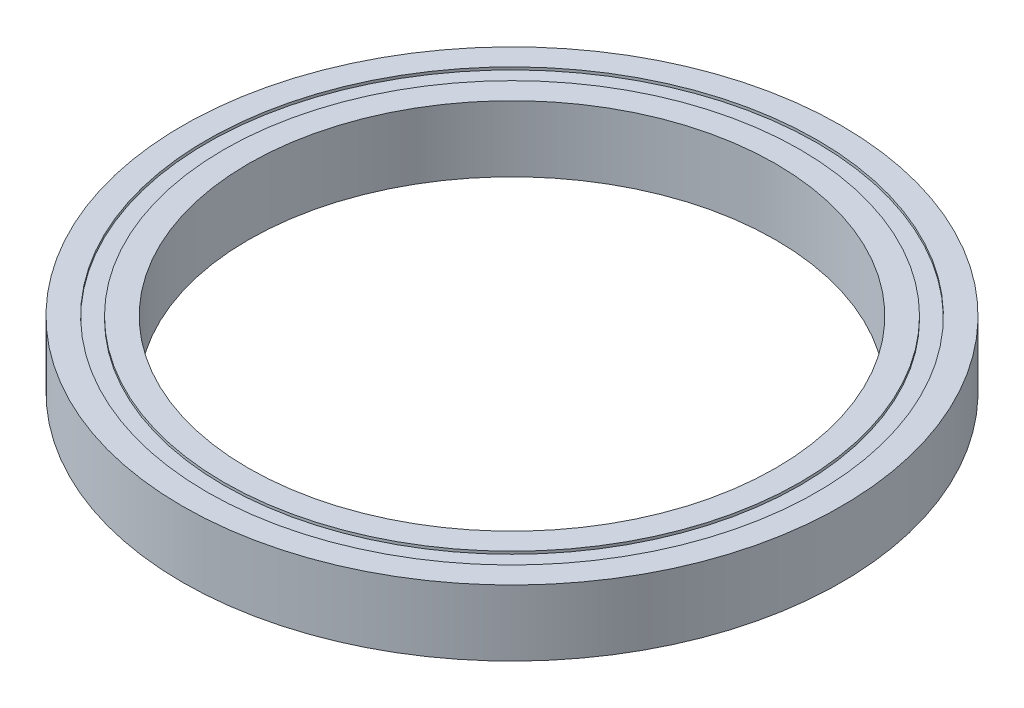
ISO-10303-21;
HEADER;
FILE_DESCRIPTION(('STEP AP214'),'2;1');
FILE_NAME('part.step','',(''),(''),'','','');
FILE_SCHEMA(('AUTOMOTIVE_DESIGN { 1 0 10303 214 1 1 1 1 }'));
ENDSEC;
DATA;
#1=APPLICATION_CONTEXT('core data for automotive mechanical design processes');
#2=APPLICATION_PROTOCOL_DEFINITION('international standard','automotive_design',2000,#1);
#3=PRODUCT_CONTEXT('',#1,'mechanical');
#4=PRODUCT('Part','Part','',(#3));
#5=PRODUCT_RELATED_PRODUCT_CATEGORY('part','',(#4));
#6=PRODUCT_DEFINITION_FORMATION('','',#4);
#7=PRODUCT_DEFINITION_CONTEXT('part definition',#1,'design');
#8=PRODUCT_DEFINITION('design','',#6,#7);
#9=PRODUCT_DEFINITION_SHAPE('','',#8);
#10=(LENGTH_UNIT() NAMED_UNIT(*) SI_UNIT(.MILLI.,.METRE.));
#11=(NAMED_UNIT(*) PLANE_ANGLE_UNIT() SI_UNIT($,.RADIAN.));
#12=(NAMED_UNIT(*) SI_UNIT($,.STERADIAN.) SOLID_ANGLE_UNIT());
#13=UNCERTAINTY_MEASURE_WITH_UNIT(LENGTH_MEASURE(1.E-05),#10,'distance_accuracy_value','');
#14=(GEOMETRIC_REPRESENTATION_CONTEXT(3) GLOBAL_UNCERTAINTY_ASSIGNED_CONTEXT((#13)) GLOBAL_UNIT_ASSIGNED_CONTEXT((#10,
#11,#12)) REPRESENTATION_CONTEXT('',''));
#15=CARTESIAN_POINT('',(0.,0.,0.));
#16=DIRECTION('',(0.,0.,1.));
#17=DIRECTION('',(1.,0.,0.));
#18=AXIS2_PLACEMENT_3D('',#15,#16,#17);
#19=CARTESIAN_POINT('',(0.,-3.175,0.));
#20=DIRECTION('',(0.,1.,0.));
#21=DIRECTION('',(0.,0.,1.));
#22=AXIS2_PLACEMENT_3D('',#19,#20,#21);
#23=PLANE('',#22);
#24=CARTESIAN_POINT('',(0.,-3.175,0.));
#25=DIRECTION('',(0.,1.,0.));
#26=DIRECTION('',(0.,0.,1.));
#27=AXIS2_PLACEMENT_3D('',#24,#25,#26);
#28=CIRCLE('',#27,25.4);
#29=CARTESIAN_POINT('',(0.,-3.175,25.4));
#30=VERTEX_POINT('',#29);
#31=EDGE_CURVE('E42',#30,#30,#28,.T.);
#32=ORIENTED_EDGE('',*,*,#31,.T.);
#33=EDGE_LOOP('',(#32));
#34=FACE_BOUND('',#33,.T.);
#35=CARTESIAN_POINT('',(0.,-3.175,0.));
#36=DIRECTION('',(0.,1.,0.));
#37=DIRECTION('',(0.,0.,1.));
#38=AXIS2_PLACEMENT_3D('',#35,#36,#37);
#39=CIRCLE('',#38,27.7622);
#40=CARTESIAN_POINT('',(0.,-3.175,27.7622));
#41=VERTEX_POINT('',#40);
#42=EDGE_CURVE('E74',#41,#41,#39,.T.);
#43=ORIENTED_EDGE('',*,*,#42,.F.);
#44=EDGE_LOOP('',(#43));
#45=FACE_BOUND('',#44,.T.);
#46=ADVANCED_FACE('F35',(#34,#45),#23,.F.);
#47=CARTESIAN_POINT('',(0.,3.175,0.));
#48=DIRECTION('',(0.,1.,0.));
#49=DIRECTION('',(0.,0.,1.));
#50=AXIS2_PLACEMENT_3D('',#47,#48,#49);
#51=PLANE('',#50);
#52=CARTESIAN_POINT('',(0.,3.175,0.));
#53=DIRECTION('',(0.,1.,0.));
#54=DIRECTION('',(0.,0.,1.));
#55=AXIS2_PLACEMENT_3D('',#52,#53,#54);
#56=CIRCLE('',#55,25.4);
#57=CARTESIAN_POINT('',(0.,3.175,25.4));
#58=VERTEX_POINT('',#57);
#59=EDGE_CURVE('E50',#58,#58,#56,.T.);
#60=ORIENTED_EDGE('',*,*,#59,.F.);
#61=EDGE_LOOP('',(#60));
#62=FACE_BOUND('',#61,.T.);
#63=CARTESIAN_POINT('',(0.,3.175,0.));
#64=DIRECTION('',(0.,1.,0.));
#65=DIRECTION('',(0.,0.,1.));
#66=AXIS2_PLACEMENT_3D('',#63,#64,#65);
#67=CIRCLE('',#66,27.7622);
#68=CARTESIAN_POINT('',(0.,3.175,27.7622));
#69=VERTEX_POINT('',#68);
#70=EDGE_CURVE('E62',#69,#69,#67,.T.);
#71=ORIENTED_EDGE('',*,*,#70,.T.);
#72=EDGE_LOOP('',(#71));
#73=FACE_BOUND('',#72,.T.);
#74=ADVANCED_FACE('F90',(#62,#73),#51,.T.);
#75=CARTESIAN_POINT('',(0.,-3.175,0.));
#76=DIRECTION('',(0.,1.,0.));
#77=DIRECTION('',(0.,0.,1.));
#78=AXIS2_PLACEMENT_3D('',#75,#76,#77);
#79=CYLINDRICAL_SURFACE('',#78,31.75);
#80=CARTESIAN_POINT('',(0.,-3.175,0.));
#81=DIRECTION('',(0.,1.,0.));
#82=DIRECTION('',(0.,0.,1.));
#83=AXIS2_PLACEMENT_3D('',#80,#81,#82);
#84=CIRCLE('',#83,31.75);
#85=CARTESIAN_POINT('',(0.,-3.175,31.75));
#86=VERTEX_POINT('',#85);
#87=EDGE_CURVE('E10',#86,#86,#84,.T.);
#88=ORIENTED_EDGE('',*,*,#87,.T.);
#89=EDGE_LOOP('',(#88));
#90=FACE_BOUND('',#89,.T.);
#91=CARTESIAN_POINT('',(0.,3.175,0.));
#92=DIRECTION('',(0.,1.,0.));
#93=DIRECTION('',(0.,0.,1.));
#94=AXIS2_PLACEMENT_3D('',#91,#92,#93);
#95=CIRCLE('',#94,31.75);
#96=CARTESIAN_POINT('',(0.,3.175,31.75));
#97=VERTEX_POINT('',#96);
#98=EDGE_CURVE('E46',#97,#97,#95,.T.);
#99=ORIENTED_EDGE('',*,*,#98,.F.);
#100=EDGE_LOOP('',(#99));
#101=FACE_BOUND('',#100,.T.);
#102=ADVANCED_FACE('F37',(#90,#101),#79,.T.);
#103=CARTESIAN_POINT('',(0.,-3.175,0.));
#104=DIRECTION('',(0.,1.,0.));
#105=DIRECTION('',(0.,0.,1.));
#106=AXIS2_PLACEMENT_3D('',#103,#104,#105);
#107=CIRCLE('',#106,29.3878);
#108=CARTESIAN_POINT('',(0.,-3.175,29.3878));
#109=VERTEX_POINT('',#108);
#110=EDGE_CURVE('E68',#109,#109,#107,.T.);
#111=ORIENTED_EDGE('',*,*,#110,.T.);
#112=EDGE_LOOP('',(#111));
#113=FACE_BOUND('',#112,.T.);
#114=ORIENTED_EDGE('',*,*,#87,.F.);
#115=EDGE_LOOP('',(#114));
#116=FACE_BOUND('',#115,.T.);
#117=ADVANCED_FACE('F91',(#113,#116),#23,.F.);
#118=CARTESIAN_POINT('',(0.,-3.175,0.));
#119=DIRECTION('',(0.,1.,0.));
#120=DIRECTION('',(0.,0.,1.));
#121=AXIS2_PLACEMENT_3D('',#118,#119,#120);
#122=CYLINDRICAL_SURFACE('',#121,25.4);
#123=ORIENTED_EDGE('',*,*,#31,.F.);
#124=EDGE_LOOP('',(#123));
#125=FACE_BOUND('',#124,.T.);
#126=ORIENTED_EDGE('',*,*,#59,.T.);
#127=EDGE_LOOP('',(#126));
#128=FACE_BOUND('',#127,.T.);
#129=ADVANCED_FACE('F100',(#125,#128),#122,.F.);
#130=CARTESIAN_POINT('',(0.,3.175,0.));
#131=DIRECTION('',(0.,1.,0.));
#132=DIRECTION('',(0.,0.,1.));
#133=AXIS2_PLACEMENT_3D('',#130,#131,#132);
#134=CIRCLE('',#133,29.3878);
#135=CARTESIAN_POINT('',(0.,3.175,29.3878));
#136=VERTEX_POINT('',#135);
#137=EDGE_CURVE('E56',#136,#136,#134,.T.);
#138=ORIENTED_EDGE('',*,*,#137,.F.);
#139=EDGE_LOOP('',(#138));
#140=FACE_BOUND('',#139,.T.);
#141=ORIENTED_EDGE('',*,*,#98,.T.);
#142=EDGE_LOOP('',(#141));
#143=FACE_BOUND('',#142,.T.);
#144=ADVANCED_FACE('F97',(#140,#143),#51,.T.);
#145=CARTESIAN_POINT('',(0.,2.921,0.));
#146=DIRECTION('',(0.,1.,0.));
#147=DIRECTION('',(0.,0.,1.));
#148=AXIS2_PLACEMENT_3D('',#145,#146,#147);
#149=CYLINDRICAL_SURFACE('',#148,29.3878);
#150=CARTESIAN_POINT('',(0.,2.921,0.));
#151=DIRECTION('',(0.,1.,0.));
#152=DIRECTION('',(0.,0.,1.));
#153=AXIS2_PLACEMENT_3D('',#150,#151,#152);
#154=CIRCLE('',#153,29.3878);
#155=CARTESIAN_POINT('',(0.,2.921,29.3878));
#156=VERTEX_POINT('',#155);
#157=EDGE_CURVE('E55',#156,#156,#154,.T.);
#158=ORIENTED_EDGE('',*,*,#157,.F.);
#159=EDGE_LOOP('',(#158));
#160=FACE_BOUND('',#159,.T.);
#161=ORIENTED_EDGE('',*,*,#137,.T.);
#162=EDGE_LOOP('',(#161));
#163=FACE_BOUND('',#162,.T.);
#164=ADVANCED_FACE('F126',(#160,#163),#149,.F.);
#165=CARTESIAN_POINT('',(0.,2.921,0.));
#166=DIRECTION('',(0.,1.,0.));
#167=DIRECTION('',(0.,0.,1.));
#168=AXIS2_PLACEMENT_3D('',#165,#166,#167);
#169=PLANE('',#168);
#170=CARTESIAN_POINT('',(0.,2.921,0.));
#171=DIRECTION('',(0.,1.,0.));
#172=DIRECTION('',(0.,0.,1.));
#173=AXIS2_PLACEMENT_3D('',#170,#171,#172);
#174=CIRCLE('',#173,27.7622);
#175=CARTESIAN_POINT('',(0.,2.921,27.7622));
#176=VERTEX_POINT('',#175);
#177=EDGE_CURVE('E59',#176,#176,#174,.T.);
#178=ORIENTED_EDGE('',*,*,#177,.F.);
#179=EDGE_LOOP('',(#178));
#180=FACE_BOUND('',#179,.T.);
#181=ORIENTED_EDGE('',*,*,#157,.T.);
#182=EDGE_LOOP('',(#181));
#183=FACE_BOUND('',#182,.T.);
#184=ADVANCED_FACE('F122',(#180,#183),#169,.T.);
#185=CARTESIAN_POINT('',(0.,2.921,0.));
#186=DIRECTION('',(0.,1.,0.));
#187=DIRECTION('',(0.,0.,1.));
#188=AXIS2_PLACEMENT_3D('',#185,#186,#187);
#189=CYLINDRICAL_SURFACE('',#188,27.7622);
#190=ORIENTED_EDGE('',*,*,#177,.T.);
#191=EDGE_LOOP('',(#190));
#192=FACE_BOUND('',#191,.T.);
#193=ORIENTED_EDGE('',*,*,#70,.F.);
#194=EDGE_LOOP('',(#193));
#195=FACE_BOUND('',#194,.T.);
#196=ADVANCED_FACE('F116',(#192,#195),#189,.T.);
#197=CARTESIAN_POINT('',(0.,-2.921,0.));
#198=DIRECTION('',(0.,-1.,0.));
#199=DIRECTION('',(0.,0.,1.));
#200=AXIS2_PLACEMENT_3D('',#197,#198,#199);
#201=PLANE('',#200);
#202=CARTESIAN_POINT('',(0.,-2.921,0.));
#203=DIRECTION('',(0.,1.,0.));
#204=DIRECTION('',(0.,0.,1.));
#205=AXIS2_PLACEMENT_3D('',#202,#203,#204);
#206=CIRCLE('',#205,29.3878);
#207=CARTESIAN_POINT('',(0.,-2.921,29.3878));
#208=VERTEX_POINT('',#207);
#209=EDGE_CURVE('E65',#208,#208,#206,.T.);
#210=ORIENTED_EDGE('',*,*,#209,.F.);
#211=EDGE_LOOP('',(#210));
#212=FACE_BOUND('',#211,.T.);
#213=CARTESIAN_POINT('',(0.,-2.921,0.));
#214=DIRECTION('',(0.,1.,0.));
#215=DIRECTION('',(0.,0.,1.));
#216=AXIS2_PLACEMENT_3D('',#213,#214,#215);
#217=CIRCLE('',#216,27.7622);
#218=CARTESIAN_POINT('',(0.,-2.921,27.7622));
#219=VERTEX_POINT('',#218);
#220=EDGE_CURVE('E71',#219,#219,#217,.T.);
#221=ORIENTED_EDGE('',*,*,#220,.T.);
#222=EDGE_LOOP('',(#221));
#223=FACE_BOUND('',#222,.T.);
#224=ADVANCED_FACE('F80',(#212,#223),#201,.T.);
#225=CARTESIAN_POINT('',(0.,-2.921,0.));
#226=DIRECTION('',(0.,-1.,0.));
#227=DIRECTION('',(0.,0.,-1.));
#228=AXIS2_PLACEMENT_3D('',#225,#226,#227);
#229=CYLINDRICAL_SURFACE('',#228,29.3878);
#230=ORIENTED_EDGE('',*,*,#209,.T.);
#231=EDGE_LOOP('',(#230));
#232=FACE_BOUND('',#231,.T.);
#233=ORIENTED_EDGE('',*,*,#110,.F.);
#234=EDGE_LOOP('',(#233));
#235=FACE_BOUND('',#234,.T.);
#236=ADVANCED_FACE('F85',(#232,#235),#229,.F.);
#237=CARTESIAN_POINT('',(0.,-2.921,0.));
#238=DIRECTION('',(0.,-1.,0.));
#239=DIRECTION('',(0.,0.,-1.));
#240=AXIS2_PLACEMENT_3D('',#237,#238,#239);
#241=CYLINDRICAL_SURFACE('',#240,27.7622);
#242=ORIENTED_EDGE('',*,*,#220,.F.);
#243=EDGE_LOOP('',(#242));
#244=FACE_BOUND('',#243,.T.);
#245=ORIENTED_EDGE('',*,*,#42,.T.);
#246=EDGE_LOOP('',(#245));
#247=FACE_BOUND('',#246,.T.);
#248=ADVANCED_FACE('F82',(#244,#247),#241,.T.);
#249=CLOSED_SHELL('',(#46,#74,#102,#117,#129,#144,#164,#184,#196,#224,#236,#248));
#250=MANIFOLD_SOLID_BREP('B2',#249);
#251=ADVANCED_BREP_SHAPE_REPRESENTATION('',(#18,#250),#14);
#252=SHAPE_DEFINITION_REPRESENTATION(#9,#251);
ENDSEC;
END-ISO-10303-21;
